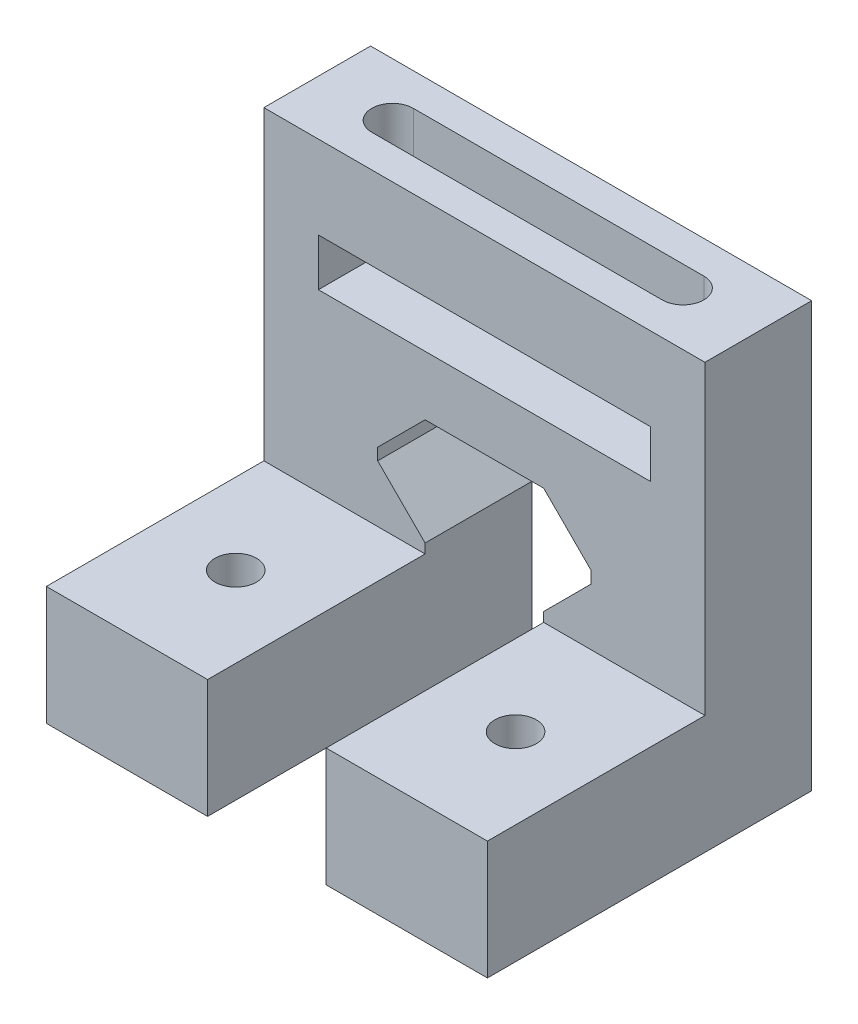
ISO-10303-21;
HEADER;
FILE_DESCRIPTION(('STEP AP214'),'2;1');
FILE_NAME('part.step','',(''),(''),'','','');
FILE_SCHEMA(('AUTOMOTIVE_DESIGN { 1 0 10303 214 1 1 1 1 }'));
ENDSEC;
DATA;
#1=APPLICATION_CONTEXT('core data for automotive mechanical design processes');
#2=APPLICATION_PROTOCOL_DEFINITION('international standard','automotive_design',2000,#1);
#3=PRODUCT_CONTEXT('',#1,'mechanical');
#4=PRODUCT('Part','Part','',(#3));
#5=PRODUCT_RELATED_PRODUCT_CATEGORY('part','',(#4));
#6=PRODUCT_DEFINITION_FORMATION('','',#4);
#7=PRODUCT_DEFINITION_CONTEXT('part definition',#1,'design');
#8=PRODUCT_DEFINITION('design','',#6,#7);
#9=PRODUCT_DEFINITION_SHAPE('','',#8);
#10=(LENGTH_UNIT() NAMED_UNIT(*) SI_UNIT(.MILLI.,.METRE.));
#11=(NAMED_UNIT(*) PLANE_ANGLE_UNIT() SI_UNIT($,.RADIAN.));
#12=(NAMED_UNIT(*) SI_UNIT($,.STERADIAN.) SOLID_ANGLE_UNIT());
#13=UNCERTAINTY_MEASURE_WITH_UNIT(LENGTH_MEASURE(1.E-05),#10,'distance_accuracy_value','');
#14=(GEOMETRIC_REPRESENTATION_CONTEXT(3) GLOBAL_UNCERTAINTY_ASSIGNED_CONTEXT((#13)) GLOBAL_UNIT_ASSIGNED_CONTEXT((#10,
#11,#12)) REPRESENTATION_CONTEXT('',''));
#15=CARTESIAN_POINT('',(0.,0.,0.));
#16=DIRECTION('',(0.,0.,1.));
#17=DIRECTION('',(1.,0.,0.));
#18=AXIS2_PLACEMENT_3D('',#15,#16,#17);
#19=CARTESIAN_POINT('',(0.,10.,-27.345));
#20=DIRECTION('',(0.,0.,1.));
#21=DIRECTION('',(1.,0.,0.));
#22=AXIS2_PLACEMENT_3D('',#19,#20,#21);
#23=PLANE('',#22);
#24=DIRECTION('',(-1.,0.,0.));
#25=VECTOR('',#24,1.);
#26=CARTESIAN_POINT('',(32.6,24.8,-27.345));
#27=LINE('',#26,#25);
#28=CARTESIAN_POINT('',(32.6,24.8,-27.345));
#29=VERTEX_POINT('',#28);
#30=CARTESIAN_POINT('',(4.6,24.8,-27.345));
#31=VERTEX_POINT('',#30);
#32=EDGE_CURVE('E379',#29,#31,#27,.T.);
#33=ORIENTED_EDGE('',*,*,#32,.F.);
#34=DIRECTION('',(0.,-1.,0.));
#35=VECTOR('',#34,1.);
#36=CARTESIAN_POINT('',(32.6,24.8,-27.345));
#37=LINE('',#36,#35);
#38=CARTESIAN_POINT('',(32.6,28.8,-27.345));
#39=VERTEX_POINT('',#38);
#40=EDGE_CURVE('E377',#39,#29,#37,.T.);
#41=ORIENTED_EDGE('',*,*,#40,.F.);
#42=DIRECTION('',(1.,0.,0.));
#43=VECTOR('',#42,1.);
#44=CARTESIAN_POINT('',(32.6,28.8,-27.345));
#45=LINE('',#44,#43);
#46=CARTESIAN_POINT('',(4.6,28.8,-27.345));
#47=VERTEX_POINT('',#46);
#48=EDGE_CURVE('E385',#47,#39,#45,.T.);
#49=ORIENTED_EDGE('',*,*,#48,.F.);
#50=DIRECTION('',(0.,1.,0.));
#51=VECTOR('',#50,1.);
#52=CARTESIAN_POINT('',(4.6,24.8,-27.345));
#53=LINE('',#52,#51);
#54=EDGE_CURVE('E382',#31,#47,#53,.T.);
#55=ORIENTED_EDGE('',*,*,#54,.F.);
#56=EDGE_LOOP('',(#33,#41,#49,#55));
#57=FACE_BOUND('',#56,.T.);
#58=DIRECTION('',(0.,1.,0.));
#59=VECTOR('',#58,1.);
#60=CARTESIAN_POINT('',(23.6,10.,-27.345));
#61=LINE('',#60,#59);
#62=CARTESIAN_POINT('',(23.6,0.,-27.345));
#63=VERTEX_POINT('',#62);
#64=CARTESIAN_POINT('',(23.6,10.8,-27.345));
#65=VERTEX_POINT('',#64);
#66=EDGE_CURVE('E313',#63,#65,#61,.T.);
#67=ORIENTED_EDGE('',*,*,#66,.T.);
#68=DIRECTION('',(0.707106781186548,0.707106781186547,0.));
#69=VECTOR('',#68,1.);
#70=CARTESIAN_POINT('',(23.6,10.8,-27.345));
#71=LINE('',#70,#69);
#72=CARTESIAN_POINT('',(27.6,14.8,-27.345));
#73=VERTEX_POINT('',#72);
#74=EDGE_CURVE('E308',#65,#73,#71,.T.);
#75=ORIENTED_EDGE('',*,*,#74,.T.);
#76=DIRECTION('',(0.,1.,0.));
#77=VECTOR('',#76,1.);
#78=CARTESIAN_POINT('',(27.6,19.8,-27.345));
#79=LINE('',#78,#77);
#80=CARTESIAN_POINT('',(27.6,15.8,-27.345));
#81=VERTEX_POINT('',#80);
#82=EDGE_CURVE('E310',#73,#81,#79,.T.);
#83=ORIENTED_EDGE('',*,*,#82,.T.);
#84=DIRECTION('',(0.707106781186551,-0.707106781186544,0.));
#85=VECTOR('',#84,1.);
#86=CARTESIAN_POINT('',(16.6999999999999,26.7,-27.345));
#87=LINE('',#86,#85);
#88=CARTESIAN_POINT('',(23.6,19.8,-27.345));
#89=VERTEX_POINT('',#88);
#90=EDGE_CURVE('E522',#81,#89,#87,.F.);
#91=ORIENTED_EDGE('',*,*,#90,.T.);
#92=DIRECTION('',(-1.,0.,0.));
#93=VECTOR('',#92,1.);
#94=CARTESIAN_POINT('',(23.6,19.8,-27.345));
#95=LINE('',#94,#93);
#96=CARTESIAN_POINT('',(13.6,19.8,-27.345));
#97=VERTEX_POINT('',#96);
#98=EDGE_CURVE('E454',#89,#97,#95,.T.);
#99=ORIENTED_EDGE('',*,*,#98,.T.);
#100=DIRECTION('',(-0.707106781186544,-0.707106781186551,0.));
#101=VECTOR('',#100,1.);
#102=CARTESIAN_POINT('',(1.90000000000007,8.09999999999995,-27.345));
#103=LINE('',#102,#101);
#104=CARTESIAN_POINT('',(9.6,15.8,-27.345));
#105=VERTEX_POINT('',#104);
#106=EDGE_CURVE('E12',#97,#105,#103,.T.);
#107=ORIENTED_EDGE('',*,*,#106,.T.);
#108=DIRECTION('',(0.,1.,0.));
#109=VECTOR('',#108,1.);
#110=CARTESIAN_POINT('',(9.6,19.8,-27.345));
#111=LINE('',#110,#109);
#112=CARTESIAN_POINT('',(9.6,14.8,-27.345));
#113=VERTEX_POINT('',#112);
#114=EDGE_CURVE('E330',#113,#105,#111,.T.);
#115=ORIENTED_EDGE('',*,*,#114,.F.);
#116=DIRECTION('',(-0.707106781186546,0.707106781186549,0.));
#117=VECTOR('',#116,1.);
#118=CARTESIAN_POINT('',(9.6,14.8,-27.345));
#119=LINE('',#118,#117);
#120=CARTESIAN_POINT('',(13.6,10.8,-27.345));
#121=VERTEX_POINT('',#120);
#122=EDGE_CURVE('E319',#113,#121,#119,.F.);
#123=ORIENTED_EDGE('',*,*,#122,.T.);
#124=DIRECTION('',(0.,-1.,0.));
#125=VECTOR('',#124,1.);
#126=CARTESIAN_POINT('',(13.6,10.,-27.345));
#127=LINE('',#126,#125);
#128=CARTESIAN_POINT('',(13.6,0.,-27.345));
#129=VERTEX_POINT('',#128);
#130=EDGE_CURVE('E489',#121,#129,#127,.T.);
#131=ORIENTED_EDGE('',*,*,#130,.T.);
#132=DIRECTION('',(-1.,0.,0.));
#133=VECTOR('',#132,1.);
#134=CARTESIAN_POINT('',(0.,0.,-27.345));
#135=LINE('',#134,#133);
#136=CARTESIAN_POINT('',(0.,0.,-27.345));
#137=VERTEX_POINT('',#136);
#138=EDGE_CURVE('E474',#129,#137,#135,.T.);
#139=ORIENTED_EDGE('',*,*,#138,.T.);
#140=DIRECTION('',(0.,-1.,0.));
#141=VECTOR('',#140,1.);
#142=CARTESIAN_POINT('',(0.,10.,-27.345));
#143=LINE('',#142,#141);
#144=CARTESIAN_POINT('',(0.,35.8,-27.345));
#145=VERTEX_POINT('',#144);
#146=EDGE_CURVE('E478',#145,#137,#143,.T.);
#147=ORIENTED_EDGE('',*,*,#146,.F.);
#148=DIRECTION('',(-1.,0.,0.));
#149=VECTOR('',#148,1.);
#150=CARTESIAN_POINT('',(31.1,35.8,-27.345));
#151=LINE('',#150,#149);
#152=CARTESIAN_POINT('',(37.2,35.8,-27.345));
#153=VERTEX_POINT('',#152);
#154=EDGE_CURVE('E451',#153,#145,#151,.T.);
#155=ORIENTED_EDGE('',*,*,#154,.F.);
#156=DIRECTION('',(0.,-1.,0.));
#157=VECTOR('',#156,1.);
#158=CARTESIAN_POINT('',(37.2,35.8,-27.345));
#159=LINE('',#158,#157);
#160=CARTESIAN_POINT('',(37.2,0.,-27.345));
#161=VERTEX_POINT('',#160);
#162=EDGE_CURVE('E462',#153,#161,#159,.T.);
#163=ORIENTED_EDGE('',*,*,#162,.T.);
#164=DIRECTION('',(-1.,0.,0.));
#165=VECTOR('',#164,1.);
#166=CARTESIAN_POINT('',(37.2,0.,-27.345));
#167=LINE('',#166,#165);
#168=EDGE_CURVE('E425',#161,#63,#167,.T.);
#169=ORIENTED_EDGE('',*,*,#168,.T.);
#170=EDGE_LOOP('',(#67,#75,#83,#91,#99,#107,#115,#123,#131,#139,#147,#155,#163,#169));
#171=FACE_BOUND('',#170,.T.);
#172=ADVANCED_FACE('F127',(#57,#171),#23,.F.);
#173=CARTESIAN_POINT('',(0.,0.,-18.345));
#174=DIRECTION('',(0.,0.,1.));
#175=DIRECTION('',(1.,0.,0.));
#176=AXIS2_PLACEMENT_3D('',#173,#174,#175);
#177=PLANE('',#176);
#178=DIRECTION('',(0.,-1.,0.));
#179=VECTOR('',#178,1.);
#180=CARTESIAN_POINT('',(27.6,19.8,-18.345));
#181=LINE('',#180,#179);
#182=CARTESIAN_POINT('',(27.6,15.8,-18.345));
#183=VERTEX_POINT('',#182);
#184=CARTESIAN_POINT('',(27.6,14.8,-18.345));
#185=VERTEX_POINT('',#184);
#186=EDGE_CURVE('E329',#183,#185,#181,.T.);
#187=ORIENTED_EDGE('',*,*,#186,.T.);
#188=DIRECTION('',(-0.707106781186548,-0.707106781186547,0.));
#189=VECTOR('',#188,1.);
#190=CARTESIAN_POINT('',(6.39999999999998,-6.39999999999999,-18.345));
#191=LINE('',#190,#189);
#192=CARTESIAN_POINT('',(23.6,10.8,-18.345));
#193=VERTEX_POINT('',#192);
#194=EDGE_CURVE('E333',#185,#193,#191,.T.);
#195=ORIENTED_EDGE('',*,*,#194,.T.);
#196=DIRECTION('',(0.,1.,0.));
#197=VECTOR('',#196,1.);
#198=CARTESIAN_POINT('',(23.6,10.,-18.345));
#199=LINE('',#198,#197);
#200=CARTESIAN_POINT('',(23.6,10.,-18.345));
#201=VERTEX_POINT('',#200);
#202=EDGE_CURVE('E445',#201,#193,#199,.T.);
#203=ORIENTED_EDGE('',*,*,#202,.F.);
#204=DIRECTION('',(-1.,0.,0.));
#205=VECTOR('',#204,1.);
#206=CARTESIAN_POINT('',(37.2,10.,-18.345));
#207=LINE('',#206,#205);
#208=CARTESIAN_POINT('',(37.2,10.,-18.345));
#209=VERTEX_POINT('',#208);
#210=EDGE_CURVE('E448',#209,#201,#207,.T.);
#211=ORIENTED_EDGE('',*,*,#210,.F.);
#212=DIRECTION('',(0.,-1.,0.));
#213=VECTOR('',#212,1.);
#214=CARTESIAN_POINT('',(37.2,35.8,-18.345));
#215=LINE('',#214,#213);
#216=CARTESIAN_POINT('',(37.2,35.8,-18.345));
#217=VERTEX_POINT('',#216);
#218=EDGE_CURVE('E459',#217,#209,#215,.T.);
#219=ORIENTED_EDGE('',*,*,#218,.F.);
#220=DIRECTION('',(-1.,0.,0.));
#221=VECTOR('',#220,1.);
#222=CARTESIAN_POINT('',(31.1,35.8,-18.345));
#223=LINE('',#222,#221);
#224=CARTESIAN_POINT('',(0.,35.8,-18.345));
#225=VERTEX_POINT('',#224);
#226=EDGE_CURVE('E435',#217,#225,#223,.T.);
#227=ORIENTED_EDGE('',*,*,#226,.T.);
#228=DIRECTION('',(0.,-1.,0.));
#229=VECTOR('',#228,1.);
#230=CARTESIAN_POINT('',(0.,35.8,-18.345));
#231=LINE('',#230,#229);
#232=CARTESIAN_POINT('',(0.,10.,-18.345));
#233=VERTEX_POINT('',#232);
#234=EDGE_CURVE('E430',#225,#233,#231,.T.);
#235=ORIENTED_EDGE('',*,*,#234,.T.);
#236=DIRECTION('',(-1.,0.,0.));
#237=VECTOR('',#236,1.);
#238=CARTESIAN_POINT('',(13.6,10.,-18.345));
#239=LINE('',#238,#237);
#240=CARTESIAN_POINT('',(13.6,10.,-18.345));
#241=VERTEX_POINT('',#240);
#242=EDGE_CURVE('E437',#241,#233,#239,.T.);
#243=ORIENTED_EDGE('',*,*,#242,.F.);
#244=DIRECTION('',(0.,1.,0.));
#245=VECTOR('',#244,1.);
#246=CARTESIAN_POINT('',(13.6,10.,-18.345));
#247=LINE('',#246,#245);
#248=CARTESIAN_POINT('',(13.6,10.8,-18.345));
#249=VERTEX_POINT('',#248);
#250=EDGE_CURVE('E440',#241,#249,#247,.T.);
#251=ORIENTED_EDGE('',*,*,#250,.T.);
#252=DIRECTION('',(0.707106781186546,-0.707106781186549,0.));
#253=VECTOR('',#252,1.);
#254=CARTESIAN_POINT('',(12.2,12.2,-18.345));
#255=LINE('',#254,#253);
#256=CARTESIAN_POINT('',(9.6,14.8,-18.345));
#257=VERTEX_POINT('',#256);
#258=EDGE_CURVE('E318',#249,#257,#255,.F.);
#259=ORIENTED_EDGE('',*,*,#258,.T.);
#260=DIRECTION('',(0.,-1.,0.));
#261=VECTOR('',#260,1.);
#262=CARTESIAN_POINT('',(9.6,19.8,-18.345));
#263=LINE('',#262,#261);
#264=CARTESIAN_POINT('',(9.6,15.8,-18.345));
#265=VERTEX_POINT('',#264);
#266=EDGE_CURVE('E344',#265,#257,#263,.T.);
#267=ORIENTED_EDGE('',*,*,#266,.F.);
#268=DIRECTION('',(0.707106781186544,0.707106781186551,0.));
#269=VECTOR('',#268,1.);
#270=CARTESIAN_POINT('',(9.6,15.8,-18.345));
#271=LINE('',#270,#269);
#272=CARTESIAN_POINT('',(13.6,19.8,-18.345));
#273=VERTEX_POINT('',#272);
#274=EDGE_CURVE('E136',#265,#273,#271,.T.);
#275=ORIENTED_EDGE('',*,*,#274,.T.);
#276=DIRECTION('',(-1.,0.,0.));
#277=VECTOR('',#276,1.);
#278=CARTESIAN_POINT('',(23.6,19.8,-18.345));
#279=LINE('',#278,#277);
#280=CARTESIAN_POINT('',(23.6,19.8,-18.345));
#281=VERTEX_POINT('',#280);
#282=EDGE_CURVE('E442',#281,#273,#279,.T.);
#283=ORIENTED_EDGE('',*,*,#282,.F.);
#284=DIRECTION('',(-0.707106781186551,0.707106781186544,0.));
#285=VECTOR('',#284,1.);
#286=CARTESIAN_POINT('',(23.6,19.8,-18.345));
#287=LINE('',#286,#285);
#288=EDGE_CURVE('E520',#281,#183,#287,.F.);
#289=ORIENTED_EDGE('',*,*,#288,.T.);
#290=EDGE_LOOP('',(#187,#195,#203,#211,#219,#227,#235,#243,#251,#259,#267,#275,#283,#289));
#291=FACE_BOUND('',#290,.T.);
#292=DIRECTION('',(0.,1.,0.));
#293=VECTOR('',#292,1.);
#294=CARTESIAN_POINT('',(32.6,0.,-18.345));
#295=LINE('',#294,#293);
#296=CARTESIAN_POINT('',(32.6,24.8,-18.345));
#297=VERTEX_POINT('',#296);
#298=CARTESIAN_POINT('',(32.6,28.8,-18.345));
#299=VERTEX_POINT('',#298);
#300=EDGE_CURVE('E504',#297,#299,#295,.T.);
#301=ORIENTED_EDGE('',*,*,#300,.F.);
#302=DIRECTION('',(1.,0.,0.));
#303=VECTOR('',#302,1.);
#304=CARTESIAN_POINT('',(0.,24.8,-18.345));
#305=LINE('',#304,#303);
#306=CARTESIAN_POINT('',(4.6,24.8,-18.345));
#307=VERTEX_POINT('',#306);
#308=EDGE_CURVE('E497',#307,#297,#305,.T.);
#309=ORIENTED_EDGE('',*,*,#308,.F.);
#310=DIRECTION('',(0.,-1.,0.));
#311=VECTOR('',#310,1.);
#312=CARTESIAN_POINT('',(4.59999999999997,0.,-18.345));
#313=LINE('',#312,#311);
#314=CARTESIAN_POINT('',(4.6,28.8,-18.345));
#315=VERTEX_POINT('',#314);
#316=EDGE_CURVE('E499',#315,#307,#313,.T.);
#317=ORIENTED_EDGE('',*,*,#316,.F.);
#318=DIRECTION('',(-1.,0.,0.));
#319=VECTOR('',#318,1.);
#320=CARTESIAN_POINT('',(0.,28.8,-18.345));
#321=LINE('',#320,#319);
#322=EDGE_CURVE('E502',#299,#315,#321,.T.);
#323=ORIENTED_EDGE('',*,*,#322,.F.);
#324=EDGE_LOOP('',(#301,#309,#317,#323));
#325=FACE_BOUND('',#324,.T.);
#326=ADVANCED_FACE('F526',(#291,#325),#177,.T.);
#327=CARTESIAN_POINT('',(32.6,28.8,0.));
#328=DIRECTION('',(0.,1.,0.));
#329=DIRECTION('',(0.,0.,1.));
#330=AXIS2_PLACEMENT_3D('',#327,#328,#329);
#331=PLANE('',#330);
#332=DIRECTION('',(-1.,0.,0.));
#333=VECTOR('',#332,1.);
#334=CARTESIAN_POINT('',(6.34999999999999,28.8,-24.595));
#335=LINE('',#334,#333);
#336=CARTESIAN_POINT('',(30.85,28.8,-24.595));
#337=VERTEX_POINT('',#336);
#338=CARTESIAN_POINT('',(6.34999999999999,28.8,-24.595));
#339=VERTEX_POINT('',#338);
#340=EDGE_CURVE('E351',#337,#339,#335,.T.);
#341=ORIENTED_EDGE('',*,*,#340,.T.);
#342=CARTESIAN_POINT('',(6.34999999999999,28.8,-22.845));
#343=DIRECTION('',(0.,1.,0.));
#344=DIRECTION('',(0.,0.,1.));
#345=AXIS2_PLACEMENT_3D('',#342,#343,#344);
#346=CIRCLE('',#345,1.75000000000001);
#347=CARTESIAN_POINT('',(4.59999999999998,28.8,-22.845));
#348=VERTEX_POINT('',#347);
#349=EDGE_CURVE('E350',#348,#339,#346,.F.);
#350=ORIENTED_EDGE('',*,*,#349,.F.);
#351=DIRECTION('',(0.,0.,-1.));
#352=VECTOR('',#351,1.);
#353=CARTESIAN_POINT('',(4.6,28.8,0.));
#354=LINE('',#353,#352);
#355=EDGE_CURVE('E397',#348,#47,#354,.T.);
#356=ORIENTED_EDGE('',*,*,#355,.T.);
#357=ORIENTED_EDGE('',*,*,#48,.T.);
#358=DIRECTION('',(0.,0.,-1.));
#359=VECTOR('',#358,1.);
#360=CARTESIAN_POINT('',(32.6,28.8,0.));
#361=LINE('',#360,#359);
#362=CARTESIAN_POINT('',(32.6,28.8,-22.845));
#363=VERTEX_POINT('',#362);
#364=EDGE_CURVE('E393',#363,#39,#361,.T.);
#365=ORIENTED_EDGE('',*,*,#364,.F.);
#366=CARTESIAN_POINT('',(30.85,28.8,-22.845));
#367=DIRECTION('',(0.,1.,0.));
#368=DIRECTION('',(0.,0.,1.));
#369=AXIS2_PLACEMENT_3D('',#366,#367,#368);
#370=CIRCLE('',#369,1.75000000000001);
#371=EDGE_CURVE('E338',#337,#363,#370,.F.);
#372=ORIENTED_EDGE('',*,*,#371,.F.);
#373=EDGE_LOOP('',(#341,#350,#356,#357,#365,#372));
#374=FACE_BOUND('',#373,.T.);
#375=ADVANCED_FACE('F596',(#374),#331,.F.);
#376=CARTESIAN_POINT('',(0.,10.,0.));
#377=DIRECTION('',(1.,0.,0.));
#378=DIRECTION('',(0.,0.,-1.));
#379=AXIS2_PLACEMENT_3D('',#376,#377,#378);
#380=PLANE('',#379);
#381=DIRECTION('',(0.,0.,1.));
#382=VECTOR('',#381,1.);
#383=CARTESIAN_POINT('',(0.,0.,0.));
#384=LINE('',#383,#382);
#385=CARTESIAN_POINT('',(0.,0.,0.));
#386=VERTEX_POINT('',#385);
#387=EDGE_CURVE('E450',#137,#386,#384,.T.);
#388=ORIENTED_EDGE('',*,*,#387,.T.);
#389=DIRECTION('',(0.,-1.,0.));
#390=VECTOR('',#389,1.);
#391=CARTESIAN_POINT('',(0.,10.,0.));
#392=LINE('',#391,#390);
#393=CARTESIAN_POINT('',(0.,10.,0.));
#394=VERTEX_POINT('',#393);
#395=EDGE_CURVE('E494',#394,#386,#392,.T.);
#396=ORIENTED_EDGE('',*,*,#395,.F.);
#397=DIRECTION('',(0.,0.,1.));
#398=VECTOR('',#397,1.);
#399=CARTESIAN_POINT('',(0.,10.,0.));
#400=LINE('',#399,#398);
#401=EDGE_CURVE('E471',#233,#394,#400,.T.);
#402=ORIENTED_EDGE('',*,*,#401,.F.);
#403=ORIENTED_EDGE('',*,*,#234,.F.);
#404=DIRECTION('',(0.,0.,-1.));
#405=VECTOR('',#404,1.);
#406=CARTESIAN_POINT('',(0.,35.8,-18.345));
#407=LINE('',#406,#405);
#408=EDGE_CURVE('E464',#225,#145,#407,.T.);
#409=ORIENTED_EDGE('',*,*,#408,.T.);
#410=ORIENTED_EDGE('',*,*,#146,.T.);
#411=EDGE_LOOP('',(#388,#396,#402,#403,#409,#410));
#412=FACE_BOUND('',#411,.T.);
#413=ADVANCED_FACE('F549',(#412),#380,.F.);
#414=CARTESIAN_POINT('',(0.,10.,0.));
#415=DIRECTION('',(0.,0.,-1.));
#416=DIRECTION('',(-1.,0.,0.));
#417=AXIS2_PLACEMENT_3D('',#414,#415,#416);
#418=PLANE('',#417);
#419=DIRECTION('',(1.,0.,0.));
#420=VECTOR('',#419,1.);
#421=CARTESIAN_POINT('',(0.,0.,0.));
#422=LINE('',#421,#420);
#423=CARTESIAN_POINT('',(13.6,0.,0.));
#424=VERTEX_POINT('',#423);
#425=EDGE_CURVE('E481',#386,#424,#422,.T.);
#426=ORIENTED_EDGE('',*,*,#425,.T.);
#427=DIRECTION('',(0.,-1.,0.));
#428=VECTOR('',#427,1.);
#429=CARTESIAN_POINT('',(13.6,10.,0.));
#430=LINE('',#429,#428);
#431=CARTESIAN_POINT('',(13.6,10.,0.));
#432=VERTEX_POINT('',#431);
#433=EDGE_CURVE('E491',#432,#424,#430,.T.);
#434=ORIENTED_EDGE('',*,*,#433,.F.);
#435=DIRECTION('',(1.,0.,0.));
#436=VECTOR('',#435,1.);
#437=CARTESIAN_POINT('',(0.,10.,0.));
#438=LINE('',#437,#436);
#439=EDGE_CURVE('E473',#394,#432,#438,.T.);
#440=ORIENTED_EDGE('',*,*,#439,.F.);
#441=ORIENTED_EDGE('',*,*,#395,.T.);
#442=EDGE_LOOP('',(#426,#434,#440,#441));
#443=FACE_BOUND('',#442,.T.);
#444=ADVANCED_FACE('F605',(#443),#418,.F.);
#445=CARTESIAN_POINT('',(13.6,10.,0.));
#446=DIRECTION('',(-1.,0.,0.));
#447=DIRECTION('',(0.,0.,1.));
#448=AXIS2_PLACEMENT_3D('',#445,#446,#447);
#449=PLANE('',#448);
#450=ORIENTED_EDGE('',*,*,#130,.F.);
#451=DIRECTION('',(0.,0.,1.));
#452=VECTOR('',#451,1.);
#453=CARTESIAN_POINT('',(13.6,10.8,0.));
#454=LINE('',#453,#452);
#455=EDGE_CURVE('E150',#121,#249,#454,.T.);
#456=ORIENTED_EDGE('',*,*,#455,.T.);
#457=ORIENTED_EDGE('',*,*,#250,.F.);
#458=DIRECTION('',(0.,0.,-1.));
#459=VECTOR('',#458,1.);
#460=CARTESIAN_POINT('',(13.6,10.,0.));
#461=LINE('',#460,#459);
#462=EDGE_CURVE('E476',#432,#241,#461,.T.);
#463=ORIENTED_EDGE('',*,*,#462,.F.);
#464=ORIENTED_EDGE('',*,*,#433,.T.);
#465=DIRECTION('',(0.,0.,-1.));
#466=VECTOR('',#465,1.);
#467=CARTESIAN_POINT('',(13.6,0.,0.));
#468=LINE('',#467,#466);
#469=EDGE_CURVE('E483',#424,#129,#468,.T.);
#470=ORIENTED_EDGE('',*,*,#469,.T.);
#471=EDGE_LOOP('',(#450,#456,#457,#463,#464,#470));
#472=FACE_BOUND('',#471,.T.);
#473=ADVANCED_FACE('F540',(#472),#449,.F.);
#474=CARTESIAN_POINT('',(0.,10.,0.));
#475=DIRECTION('',(0.,-1.,0.));
#476=DIRECTION('',(0.,0.,-1.));
#477=AXIS2_PLACEMENT_3D('',#474,#475,#476);
#478=PLANE('',#477);
#479=CARTESIAN_POINT('',(6.8,10.,-9.1725));
#480=DIRECTION('',(0.,1.,0.));
#481=DIRECTION('',(0.,0.,-1.));
#482=AXIS2_PLACEMENT_3D('',#479,#480,#481);
#483=CIRCLE('',#482,1.75);
#484=CARTESIAN_POINT('',(6.8,10.,-10.9225));
#485=VERTEX_POINT('',#484);
#486=EDGE_CURVE('E409',#485,#485,#483,.T.);
#487=ORIENTED_EDGE('',*,*,#486,.F.);
#488=EDGE_LOOP('',(#487));
#489=FACE_BOUND('',#488,.T.);
#490=ORIENTED_EDGE('',*,*,#462,.T.);
#491=ORIENTED_EDGE('',*,*,#242,.T.);
#492=ORIENTED_EDGE('',*,*,#401,.T.);
#493=ORIENTED_EDGE('',*,*,#439,.T.);
#494=EDGE_LOOP('',(#490,#491,#492,#493));
#495=FACE_BOUND('',#494,.T.);
#496=ADVANCED_FACE('F604',(#489,#495),#478,.F.);
#497=CARTESIAN_POINT('',(0.,0.,0.));
#498=DIRECTION('',(0.,-1.,0.));
#499=DIRECTION('',(0.,0.,-1.));
#500=AXIS2_PLACEMENT_3D('',#497,#498,#499);
#501=PLANE('',#500);
#502=CARTESIAN_POINT('',(6.8,0.,-9.1725));
#503=DIRECTION('',(0.,1.,0.));
#504=DIRECTION('',(0.,0.,-1.));
#505=AXIS2_PLACEMENT_3D('',#502,#503,#504);
#506=CIRCLE('',#505,1.75);
#507=CARTESIAN_POINT('',(6.8,0.,-10.9225));
#508=VERTEX_POINT('',#507);
#509=EDGE_CURVE('E392',#508,#508,#506,.T.);
#510=ORIENTED_EDGE('',*,*,#509,.T.);
#511=EDGE_LOOP('',(#510));
#512=FACE_BOUND('',#511,.T.);
#513=ORIENTED_EDGE('',*,*,#387,.F.);
#514=ORIENTED_EDGE('',*,*,#138,.F.);
#515=ORIENTED_EDGE('',*,*,#469,.F.);
#516=ORIENTED_EDGE('',*,*,#425,.F.);
#517=EDGE_LOOP('',(#513,#514,#515,#516));
#518=FACE_BOUND('',#517,.T.);
#519=ADVANCED_FACE('F547',(#512,#518),#501,.T.);
#520=CARTESIAN_POINT('',(31.1,35.8,-18.345));
#521=DIRECTION('',(0.,-1.,0.));
#522=DIRECTION('',(0.,0.,-1.));
#523=AXIS2_PLACEMENT_3D('',#520,#521,#522);
#524=PLANE('',#523);
#525=DIRECTION('',(1.,0.,0.));
#526=VECTOR('',#525,1.);
#527=CARTESIAN_POINT('',(6.34999999999999,35.8,-21.095));
#528=LINE('',#527,#526);
#529=CARTESIAN_POINT('',(6.34999999999999,35.8,-21.095));
#530=VERTEX_POINT('',#529);
#531=CARTESIAN_POINT('',(30.85,35.8,-21.095));
#532=VERTEX_POINT('',#531);
#533=EDGE_CURVE('E356',#530,#532,#528,.T.);
#534=ORIENTED_EDGE('',*,*,#533,.F.);
#535=CARTESIAN_POINT('',(6.34999999999999,35.8,-22.845));
#536=DIRECTION('',(0.,1.,0.));
#537=DIRECTION('',(0.,0.,1.));
#538=AXIS2_PLACEMENT_3D('',#535,#536,#537);
#539=CIRCLE('',#538,1.75000000000001);
#540=CARTESIAN_POINT('',(6.34999999999999,35.8,-24.595));
#541=VERTEX_POINT('',#540);
#542=EDGE_CURVE('E354',#541,#530,#539,.T.);
#543=ORIENTED_EDGE('',*,*,#542,.F.);
#544=DIRECTION('',(1.,0.,0.));
#545=VECTOR('',#544,1.);
#546=CARTESIAN_POINT('',(6.34999999999999,35.8,-24.595));
#547=LINE('',#546,#545);
#548=CARTESIAN_POINT('',(30.85,35.8,-24.595));
#549=VERTEX_POINT('',#548);
#550=EDGE_CURVE('E362',#541,#549,#547,.T.);
#551=ORIENTED_EDGE('',*,*,#550,.T.);
#552=CARTESIAN_POINT('',(30.85,35.8,-22.845));
#553=DIRECTION('',(0.,1.,0.));
#554=DIRECTION('',(0.,0.,1.));
#555=AXIS2_PLACEMENT_3D('',#552,#553,#554);
#556=CIRCLE('',#555,1.75000000000001);
#557=EDGE_CURVE('E359',#532,#549,#556,.T.);
#558=ORIENTED_EDGE('',*,*,#557,.F.);
#559=EDGE_LOOP('',(#534,#543,#551,#558));
#560=FACE_BOUND('',#559,.T.);
#561=ORIENTED_EDGE('',*,*,#154,.T.);
#562=ORIENTED_EDGE('',*,*,#408,.F.);
#563=ORIENTED_EDGE('',*,*,#226,.F.);
#564=DIRECTION('',(0.,0.,-1.));
#565=VECTOR('',#564,1.);
#566=CARTESIAN_POINT('',(37.2,35.8,-18.345));
#567=LINE('',#566,#565);
#568=EDGE_CURVE('E455',#217,#153,#567,.T.);
#569=ORIENTED_EDGE('',*,*,#568,.T.);
#570=EDGE_LOOP('',(#561,#562,#563,#569));
#571=FACE_BOUND('',#570,.T.);
#572=ADVANCED_FACE('F554',(#560,#571),#524,.F.);
#573=CARTESIAN_POINT('',(23.6,19.8,-18.345));
#574=DIRECTION('',(0.,-1.,0.));
#575=DIRECTION('',(0.,0.,-1.));
#576=AXIS2_PLACEMENT_3D('',#573,#574,#575);
#577=PLANE('',#576);
#578=ORIENTED_EDGE('',*,*,#98,.F.);
#579=DIRECTION('',(0.,0.,1.));
#580=VECTOR('',#579,1.);
#581=CARTESIAN_POINT('',(23.6,19.8,-18.345));
#582=LINE('',#581,#580);
#583=EDGE_CURVE('E508',#89,#281,#582,.T.);
#584=ORIENTED_EDGE('',*,*,#583,.T.);
#585=ORIENTED_EDGE('',*,*,#282,.T.);
#586=DIRECTION('',(0.,0.,-1.));
#587=VECTOR('',#586,1.);
#588=CARTESIAN_POINT('',(13.6,19.8,-18.345));
#589=LINE('',#588,#587);
#590=EDGE_CURVE('E506',#273,#97,#589,.T.);
#591=ORIENTED_EDGE('',*,*,#590,.T.);
#592=EDGE_LOOP('',(#578,#584,#585,#591));
#593=FACE_BOUND('',#592,.T.);
#594=ADVANCED_FACE('F530',(#593),#577,.T.);
#595=CARTESIAN_POINT('',(23.6,10.,-18.345));
#596=DIRECTION('',(-1.,0.,0.));
#597=DIRECTION('',(0.,0.,1.));
#598=AXIS2_PLACEMENT_3D('',#595,#596,#597);
#599=PLANE('',#598);
#600=ORIENTED_EDGE('',*,*,#202,.T.);
#601=DIRECTION('',(0.,0.,-1.));
#602=VECTOR('',#601,1.);
#603=CARTESIAN_POINT('',(23.6,10.8,-27.345));
#604=LINE('',#603,#602);
#605=EDGE_CURVE('E512',#193,#65,#604,.T.);
#606=ORIENTED_EDGE('',*,*,#605,.T.);
#607=ORIENTED_EDGE('',*,*,#66,.F.);
#608=DIRECTION('',(0.,0.,1.));
#609=VECTOR('',#608,1.);
#610=CARTESIAN_POINT('',(23.6,0.,0.));
#611=LINE('',#610,#609);
#612=CARTESIAN_POINT('',(23.6,0.,0.));
#613=VERTEX_POINT('',#612);
#614=EDGE_CURVE('E422',#63,#613,#611,.T.);
#615=ORIENTED_EDGE('',*,*,#614,.T.);
#616=DIRECTION('',(0.,-1.,0.));
#617=VECTOR('',#616,1.);
#618=CARTESIAN_POINT('',(23.6,10.,0.));
#619=LINE('',#618,#617);
#620=CARTESIAN_POINT('',(23.6,10.,0.));
#621=VERTEX_POINT('',#620);
#622=EDGE_CURVE('E405',#621,#613,#619,.T.);
#623=ORIENTED_EDGE('',*,*,#622,.F.);
#624=DIRECTION('',(0.,0.,1.));
#625=VECTOR('',#624,1.);
#626=CARTESIAN_POINT('',(23.6,10.,0.));
#627=LINE('',#626,#625);
#628=EDGE_CURVE('E432',#201,#621,#627,.T.);
#629=ORIENTED_EDGE('',*,*,#628,.F.);
#630=EDGE_LOOP('',(#600,#606,#607,#615,#623,#629));
#631=FACE_BOUND('',#630,.T.);
#632=ADVANCED_FACE('F573',(#631),#599,.T.);
#633=CARTESIAN_POINT('',(37.2,35.8,-18.345));
#634=DIRECTION('',(1.,0.,0.));
#635=DIRECTION('',(0.,0.,-1.));
#636=AXIS2_PLACEMENT_3D('',#633,#634,#635);
#637=PLANE('',#636);
#638=ORIENTED_EDGE('',*,*,#162,.F.);
#639=ORIENTED_EDGE('',*,*,#568,.F.);
#640=ORIENTED_EDGE('',*,*,#218,.T.);
#641=DIRECTION('',(0.,0.,-1.));
#642=VECTOR('',#641,1.);
#643=CARTESIAN_POINT('',(37.2,10.,0.));
#644=LINE('',#643,#642);
#645=CARTESIAN_POINT('',(37.2,10.,0.));
#646=VERTEX_POINT('',#645);
#647=EDGE_CURVE('E423',#646,#209,#644,.T.);
#648=ORIENTED_EDGE('',*,*,#647,.F.);
#649=DIRECTION('',(0.,-1.,0.));
#650=VECTOR('',#649,1.);
#651=CARTESIAN_POINT('',(37.2,10.,0.));
#652=LINE('',#651,#650);
#653=CARTESIAN_POINT('',(37.2,0.,0.));
#654=VERTEX_POINT('',#653);
#655=EDGE_CURVE('E416',#646,#654,#652,.T.);
#656=ORIENTED_EDGE('',*,*,#655,.T.);
#657=DIRECTION('',(0.,0.,-1.));
#658=VECTOR('',#657,1.);
#659=CARTESIAN_POINT('',(37.2,0.,0.));
#660=LINE('',#659,#658);
#661=EDGE_CURVE('E427',#654,#161,#660,.T.);
#662=ORIENTED_EDGE('',*,*,#661,.T.);
#663=EDGE_LOOP('',(#638,#639,#640,#648,#656,#662));
#664=FACE_BOUND('',#663,.T.);
#665=ADVANCED_FACE('F564',(#664),#637,.T.);
#666=CARTESIAN_POINT('',(37.2,10.,0.));
#667=DIRECTION('',(0.,0.,-1.));
#668=DIRECTION('',(-1.,0.,0.));
#669=AXIS2_PLACEMENT_3D('',#666,#667,#668);
#670=PLANE('',#669);
#671=DIRECTION('',(1.,0.,0.));
#672=VECTOR('',#671,1.);
#673=CARTESIAN_POINT('',(37.2,0.,0.));
#674=LINE('',#673,#672);
#675=EDGE_CURVE('E420',#613,#654,#674,.T.);
#676=ORIENTED_EDGE('',*,*,#675,.T.);
#677=ORIENTED_EDGE('',*,*,#655,.F.);
#678=DIRECTION('',(1.,0.,0.));
#679=VECTOR('',#678,1.);
#680=CARTESIAN_POINT('',(37.2,10.,0.));
#681=LINE('',#680,#679);
#682=EDGE_CURVE('E419',#621,#646,#681,.T.);
#683=ORIENTED_EDGE('',*,*,#682,.F.);
#684=ORIENTED_EDGE('',*,*,#622,.T.);
#685=EDGE_LOOP('',(#676,#677,#683,#684));
#686=FACE_BOUND('',#685,.T.);
#687=ADVANCED_FACE('F569',(#686),#670,.F.);
#688=CARTESIAN_POINT('',(0.,10.,0.));
#689=DIRECTION('',(0.,1.,0.));
#690=DIRECTION('',(0.,0.,1.));
#691=AXIS2_PLACEMENT_3D('',#688,#689,#690);
#692=PLANE('',#691);
#693=CARTESIAN_POINT('',(30.4,10.,-9.1725));
#694=DIRECTION('',(0.,1.,0.));
#695=DIRECTION('',(0.,0.,1.));
#696=AXIS2_PLACEMENT_3D('',#693,#694,#695);
#697=CIRCLE('',#696,1.75);
#698=CARTESIAN_POINT('',(30.4,10.,-7.4225));
#699=VERTEX_POINT('',#698);
#700=EDGE_CURVE('E406',#699,#699,#697,.T.);
#701=ORIENTED_EDGE('',*,*,#700,.F.);
#702=EDGE_LOOP('',(#701));
#703=FACE_BOUND('',#702,.T.);
#704=ORIENTED_EDGE('',*,*,#647,.T.);
#705=ORIENTED_EDGE('',*,*,#210,.T.);
#706=ORIENTED_EDGE('',*,*,#628,.T.);
#707=ORIENTED_EDGE('',*,*,#682,.T.);
#708=EDGE_LOOP('',(#704,#705,#706,#707));
#709=FACE_BOUND('',#708,.T.);
#710=ADVANCED_FACE('F838',(#703,#709),#692,.T.);
#711=CARTESIAN_POINT('',(0.,0.,0.));
#712=DIRECTION('',(0.,1.,0.));
#713=DIRECTION('',(0.,0.,1.));
#714=AXIS2_PLACEMENT_3D('',#711,#712,#713);
#715=PLANE('',#714);
#716=CARTESIAN_POINT('',(30.4,0.,-9.1725));
#717=DIRECTION('',(0.,1.,0.));
#718=DIRECTION('',(0.,0.,1.));
#719=AXIS2_PLACEMENT_3D('',#716,#717,#718);
#720=CIRCLE('',#719,1.75);
#721=CARTESIAN_POINT('',(30.4,0.,-7.4225));
#722=VERTEX_POINT('',#721);
#723=EDGE_CURVE('E402',#722,#722,#720,.T.);
#724=ORIENTED_EDGE('',*,*,#723,.T.);
#725=EDGE_LOOP('',(#724));
#726=FACE_BOUND('',#725,.T.);
#727=ORIENTED_EDGE('',*,*,#661,.F.);
#728=ORIENTED_EDGE('',*,*,#675,.F.);
#729=ORIENTED_EDGE('',*,*,#614,.F.);
#730=ORIENTED_EDGE('',*,*,#168,.F.);
#731=EDGE_LOOP('',(#727,#728,#729,#730));
#732=FACE_BOUND('',#731,.T.);
#733=ADVANCED_FACE('F562',(#726,#732),#715,.F.);
#734=CARTESIAN_POINT('',(30.4,0.,-9.1725));
#735=DIRECTION('',(0.,1.,0.));
#736=DIRECTION('',(0.,0.,1.));
#737=AXIS2_PLACEMENT_3D('',#734,#735,#736);
#738=CYLINDRICAL_SURFACE('',#737,1.75);
#739=ORIENTED_EDGE('',*,*,#723,.F.);
#740=EDGE_LOOP('',(#739));
#741=FACE_BOUND('',#740,.T.);
#742=ORIENTED_EDGE('',*,*,#700,.T.);
#743=EDGE_LOOP('',(#742));
#744=FACE_BOUND('',#743,.T.);
#745=ADVANCED_FACE('F793',(#741,#744),#738,.F.);
#746=CARTESIAN_POINT('',(6.8,0.,-9.1725));
#747=DIRECTION('',(0.,1.,0.));
#748=DIRECTION('',(0.,0.,1.));
#749=AXIS2_PLACEMENT_3D('',#746,#747,#748);
#750=CYLINDRICAL_SURFACE('',#749,1.75);
#751=ORIENTED_EDGE('',*,*,#509,.F.);
#752=EDGE_LOOP('',(#751));
#753=FACE_BOUND('',#752,.T.);
#754=ORIENTED_EDGE('',*,*,#486,.T.);
#755=EDGE_LOOP('',(#754));
#756=FACE_BOUND('',#755,.T.);
#757=ADVANCED_FACE('F632',(#753,#756),#750,.F.);
#758=CARTESIAN_POINT('',(32.6,24.8,0.));
#759=DIRECTION('',(1.,0.,0.));
#760=DIRECTION('',(0.,0.,-1.));
#761=AXIS2_PLACEMENT_3D('',#758,#759,#760);
#762=PLANE('',#761);
#763=ORIENTED_EDGE('',*,*,#300,.T.);
#764=EDGE_CURVE('E389',#299,#363,#361,.T.);
#765=ORIENTED_EDGE('',*,*,#764,.T.);
#766=ORIENTED_EDGE('',*,*,#364,.T.);
#767=ORIENTED_EDGE('',*,*,#40,.T.);
#768=DIRECTION('',(0.,0.,-1.));
#769=VECTOR('',#768,1.);
#770=CARTESIAN_POINT('',(32.6,24.8,0.));
#771=LINE('',#770,#769);
#772=EDGE_CURVE('E388',#297,#29,#771,.T.);
#773=ORIENTED_EDGE('',*,*,#772,.F.);
#774=EDGE_LOOP('',(#763,#765,#766,#767,#773));
#775=FACE_BOUND('',#774,.T.);
#776=ADVANCED_FACE('F624',(#775),#762,.F.);
#777=EDGE_CURVE('E394',#315,#348,#354,.T.);
#778=ORIENTED_EDGE('',*,*,#777,.T.);
#779=CARTESIAN_POINT('',(6.34999999999999,28.8,-21.095));
#780=VERTEX_POINT('',#779);
#781=EDGE_CURVE('E336',#780,#348,#346,.F.);
#782=ORIENTED_EDGE('',*,*,#781,.F.);
#783=DIRECTION('',(-1.,0.,0.));
#784=VECTOR('',#783,1.);
#785=CARTESIAN_POINT('',(6.34999999999999,28.8,-21.095));
#786=LINE('',#785,#784);
#787=CARTESIAN_POINT('',(30.85,28.8,-21.095));
#788=VERTEX_POINT('',#787);
#789=EDGE_CURVE('E368',#788,#780,#786,.T.);
#790=ORIENTED_EDGE('',*,*,#789,.F.);
#791=EDGE_CURVE('E334',#363,#788,#370,.F.);
#792=ORIENTED_EDGE('',*,*,#791,.F.);
#793=ORIENTED_EDGE('',*,*,#764,.F.);
#794=ORIENTED_EDGE('',*,*,#322,.T.);
#795=EDGE_LOOP('',(#778,#782,#790,#792,#793,#794));
#796=FACE_BOUND('',#795,.T.);
#797=ADVANCED_FACE('F615',(#796),#331,.F.);
#798=CARTESIAN_POINT('',(4.6,24.8,0.));
#799=DIRECTION('',(-1.,0.,0.));
#800=DIRECTION('',(0.,-1.,0.));
#801=AXIS2_PLACEMENT_3D('',#798,#799,#800);
#802=PLANE('',#801);
#803=ORIENTED_EDGE('',*,*,#316,.T.);
#804=DIRECTION('',(0.,0.,-1.));
#805=VECTOR('',#804,1.);
#806=CARTESIAN_POINT('',(4.6,24.8,0.));
#807=LINE('',#806,#805);
#808=EDGE_CURVE('E398',#307,#31,#807,.T.);
#809=ORIENTED_EDGE('',*,*,#808,.T.);
#810=ORIENTED_EDGE('',*,*,#54,.T.);
#811=ORIENTED_EDGE('',*,*,#355,.F.);
#812=ORIENTED_EDGE('',*,*,#777,.F.);
#813=EDGE_LOOP('',(#803,#809,#810,#811,#812));
#814=FACE_BOUND('',#813,.T.);
#815=ADVANCED_FACE('F623',(#814),#802,.F.);
#816=CARTESIAN_POINT('',(32.6,24.8,0.));
#817=DIRECTION('',(0.,-1.,0.));
#818=DIRECTION('',(0.,0.,-1.));
#819=AXIS2_PLACEMENT_3D('',#816,#817,#818);
#820=PLANE('',#819);
#821=ORIENTED_EDGE('',*,*,#308,.T.);
#822=ORIENTED_EDGE('',*,*,#772,.T.);
#823=ORIENTED_EDGE('',*,*,#32,.T.);
#824=ORIENTED_EDGE('',*,*,#808,.F.);
#825=EDGE_LOOP('',(#821,#822,#823,#824));
#826=FACE_BOUND('',#825,.T.);
#827=ADVANCED_FACE('F630',(#826),#820,.F.);
#828=CARTESIAN_POINT('',(6.34999999999999,-0.001000000000001,-22.845));
#829=DIRECTION('',(0.,1.,0.));
#830=DIRECTION('',(0.,0.,1.));
#831=AXIS2_PLACEMENT_3D('',#828,#829,#830);
#832=CYLINDRICAL_SURFACE('',#831,1.75000000000001);
#833=ORIENTED_EDGE('',*,*,#349,.T.);
#834=DIRECTION('',(0.,1.,0.));
#835=VECTOR('',#834,1.);
#836=CARTESIAN_POINT('',(6.34999999999999,-0.001000000000001,-24.595));
#837=LINE('',#836,#835);
#838=EDGE_CURVE('E366',#339,#541,#837,.T.);
#839=ORIENTED_EDGE('',*,*,#838,.T.);
#840=ORIENTED_EDGE('',*,*,#542,.T.);
#841=DIRECTION('',(0.,1.,0.));
#842=VECTOR('',#841,1.);
#843=CARTESIAN_POINT('',(6.34999999999999,-0.001000000000001,-21.095));
#844=LINE('',#843,#842);
#845=EDGE_CURVE('E365',#780,#530,#844,.T.);
#846=ORIENTED_EDGE('',*,*,#845,.F.);
#847=ORIENTED_EDGE('',*,*,#781,.T.);
#848=EDGE_LOOP('',(#833,#839,#840,#846,#847));
#849=FACE_BOUND('',#848,.T.);
#850=ADVANCED_FACE('F668',(#849),#832,.F.);
#851=CARTESIAN_POINT('',(6.34999999999999,-0.001000000000001,-24.595));
#852=DIRECTION('',(0.,0.,1.));
#853=DIRECTION('',(1.,0.,0.));
#854=AXIS2_PLACEMENT_3D('',#851,#852,#853);
#855=PLANE('',#854);
#856=DIRECTION('',(0.,1.,0.));
#857=VECTOR('',#856,1.);
#858=CARTESIAN_POINT('',(30.85,-0.001000000000001,-24.595));
#859=LINE('',#858,#857);
#860=EDGE_CURVE('E369',#337,#549,#859,.T.);
#861=ORIENTED_EDGE('',*,*,#860,.T.);
#862=ORIENTED_EDGE('',*,*,#550,.F.);
#863=ORIENTED_EDGE('',*,*,#838,.F.);
#864=ORIENTED_EDGE('',*,*,#340,.F.);
#865=EDGE_LOOP('',(#861,#862,#863,#864));
#866=FACE_BOUND('',#865,.T.);
#867=ADVANCED_FACE('F667',(#866),#855,.T.);
#868=CARTESIAN_POINT('',(30.85,-0.001000000000001,-22.845));
#869=DIRECTION('',(0.,1.,0.));
#870=DIRECTION('',(0.,0.,1.));
#871=AXIS2_PLACEMENT_3D('',#868,#869,#870);
#872=CYLINDRICAL_SURFACE('',#871,1.75000000000001);
#873=ORIENTED_EDGE('',*,*,#791,.T.);
#874=DIRECTION('',(0.,1.,0.));
#875=VECTOR('',#874,1.);
#876=CARTESIAN_POINT('',(30.85,-0.001000000000001,-21.095));
#877=LINE('',#876,#875);
#878=EDGE_CURVE('E371',#788,#532,#877,.T.);
#879=ORIENTED_EDGE('',*,*,#878,.T.);
#880=ORIENTED_EDGE('',*,*,#557,.T.);
#881=ORIENTED_EDGE('',*,*,#860,.F.);
#882=ORIENTED_EDGE('',*,*,#371,.T.);
#883=EDGE_LOOP('',(#873,#879,#880,#881,#882));
#884=FACE_BOUND('',#883,.T.);
#885=ADVANCED_FACE('F657',(#884),#872,.F.);
#886=CARTESIAN_POINT('',(6.34999999999999,-0.001000000000001,-21.095));
#887=DIRECTION('',(0.,0.,1.));
#888=DIRECTION('',(1.,0.,0.));
#889=AXIS2_PLACEMENT_3D('',#886,#887,#888);
#890=PLANE('',#889);
#891=ORIENTED_EDGE('',*,*,#789,.T.);
#892=ORIENTED_EDGE('',*,*,#845,.T.);
#893=ORIENTED_EDGE('',*,*,#533,.T.);
#894=ORIENTED_EDGE('',*,*,#878,.F.);
#895=EDGE_LOOP('',(#891,#892,#893,#894));
#896=FACE_BOUND('',#895,.T.);
#897=ADVANCED_FACE('F660',(#896),#890,.F.);
#898=CARTESIAN_POINT('',(27.6,19.8,-27.346));
#899=DIRECTION('',(-1.,0.,0.));
#900=DIRECTION('',(0.,0.,1.));
#901=AXIS2_PLACEMENT_3D('',#898,#899,#900);
#902=PLANE('',#901);
#903=ORIENTED_EDGE('',*,*,#186,.F.);
#904=DIRECTION('',(0.,0.,-1.));
#905=VECTOR('',#904,1.);
#906=CARTESIAN_POINT('',(27.6,15.8,-27.345));
#907=LINE('',#906,#905);
#908=EDGE_CURVE('E328',#183,#81,#907,.T.);
#909=ORIENTED_EDGE('',*,*,#908,.T.);
#910=ORIENTED_EDGE('',*,*,#82,.F.);
#911=DIRECTION('',(0.,0.,1.));
#912=VECTOR('',#911,1.);
#913=CARTESIAN_POINT('',(27.6,14.8,-27.346));
#914=LINE('',#913,#912);
#915=EDGE_CURVE('E325',#73,#185,#914,.T.);
#916=ORIENTED_EDGE('',*,*,#915,.T.);
#917=EDGE_LOOP('',(#903,#909,#910,#916));
#918=FACE_BOUND('',#917,.T.);
#919=ADVANCED_FACE('F324',(#918),#902,.T.);
#920=CARTESIAN_POINT('',(9.6,19.8,-27.346));
#921=DIRECTION('',(-1.,0.,0.));
#922=DIRECTION('',(0.,-1.,0.));
#923=AXIS2_PLACEMENT_3D('',#920,#921,#922);
#924=PLANE('',#923);
#925=ORIENTED_EDGE('',*,*,#114,.T.);
#926=DIRECTION('',(0.,0.,1.));
#927=VECTOR('',#926,1.);
#928=CARTESIAN_POINT('',(9.6,15.8,-27.346));
#929=LINE('',#928,#927);
#930=EDGE_CURVE('E518',#105,#265,#929,.T.);
#931=ORIENTED_EDGE('',*,*,#930,.T.);
#932=ORIENTED_EDGE('',*,*,#266,.T.);
#933=DIRECTION('',(0.,0.,1.));
#934=VECTOR('',#933,1.);
#935=CARTESIAN_POINT('',(9.6,14.8,-27.346));
#936=LINE('',#935,#934);
#937=EDGE_CURVE('E343',#113,#257,#936,.T.);
#938=ORIENTED_EDGE('',*,*,#937,.F.);
#939=EDGE_LOOP('',(#925,#931,#932,#938));
#940=FACE_BOUND('',#939,.T.);
#941=ADVANCED_FACE('F536',(#940),#924,.F.);
#942=CARTESIAN_POINT('',(23.6,19.8,-18.345));
#943=DIRECTION('',(-0.707106781186544,-0.707106781186551,0.));
#944=DIRECTION('',(0.,0.,-1.));
#945=AXIS2_PLACEMENT_3D('',#942,#943,#944);
#946=PLANE('',#945);
#947=ORIENTED_EDGE('',*,*,#90,.F.);
#948=ORIENTED_EDGE('',*,*,#908,.F.);
#949=ORIENTED_EDGE('',*,*,#288,.F.);
#950=ORIENTED_EDGE('',*,*,#583,.F.);
#951=EDGE_LOOP('',(#947,#948,#949,#950));
#952=FACE_BOUND('',#951,.T.);
#953=ADVANCED_FACE('F578',(#952),#946,.T.);
#954=CARTESIAN_POINT('',(23.6,10.8,-18.345));
#955=DIRECTION('',(-0.707106781186547,0.707106781186548,0.));
#956=DIRECTION('',(0.,0.,1.));
#957=AXIS2_PLACEMENT_3D('',#954,#955,#956);
#958=PLANE('',#957);
#959=ORIENTED_EDGE('',*,*,#194,.F.);
#960=ORIENTED_EDGE('',*,*,#915,.F.);
#961=ORIENTED_EDGE('',*,*,#74,.F.);
#962=ORIENTED_EDGE('',*,*,#605,.F.);
#963=EDGE_LOOP('',(#959,#960,#961,#962));
#964=FACE_BOUND('',#963,.T.);
#965=ADVANCED_FACE('F332',(#964),#958,.T.);
#966=CARTESIAN_POINT('',(9.6,14.8,-27.346));
#967=DIRECTION('',(-0.707106781186549,-0.707106781186546,0.));
#968=DIRECTION('',(0.,0.,-1.));
#969=AXIS2_PLACEMENT_3D('',#966,#967,#968);
#970=PLANE('',#969);
#971=ORIENTED_EDGE('',*,*,#258,.F.);
#972=ORIENTED_EDGE('',*,*,#455,.F.);
#973=ORIENTED_EDGE('',*,*,#122,.F.);
#974=ORIENTED_EDGE('',*,*,#937,.T.);
#975=EDGE_LOOP('',(#971,#972,#973,#974));
#976=FACE_BOUND('',#975,.T.);
#977=ADVANCED_FACE('F539',(#976),#970,.F.);
#978=CARTESIAN_POINT('',(9.6,15.8,-27.346));
#979=DIRECTION('',(-0.707106781186551,0.707106781186544,0.));
#980=DIRECTION('',(0.,0.,1.));
#981=AXIS2_PLACEMENT_3D('',#978,#979,#980);
#982=PLANE('',#981);
#983=ORIENTED_EDGE('',*,*,#106,.F.);
#984=ORIENTED_EDGE('',*,*,#590,.F.);
#985=ORIENTED_EDGE('',*,*,#274,.F.);
#986=ORIENTED_EDGE('',*,*,#930,.F.);
#987=EDGE_LOOP('',(#983,#984,#985,#986));
#988=FACE_BOUND('',#987,.T.);
#989=ADVANCED_FACE('F130',(#988),#982,.F.);
#990=CLOSED_SHELL('',(#172,#326,#375,#413,#444,#473,#496,#519,#572,#594,#632,#665,#687,#710,
#733,#745,#757,#776,#797,#815,#827,#850,#867,#885,#897,#919,#941,#953,#965,#977,#989));
#991=MANIFOLD_SOLID_BREP('B2',#990);
#992=ADVANCED_BREP_SHAPE_REPRESENTATION('',(#18,#991),#14);
#993=SHAPE_DEFINITION_REPRESENTATION(#9,#992);
ENDSEC;
END-ISO-10303-21;
